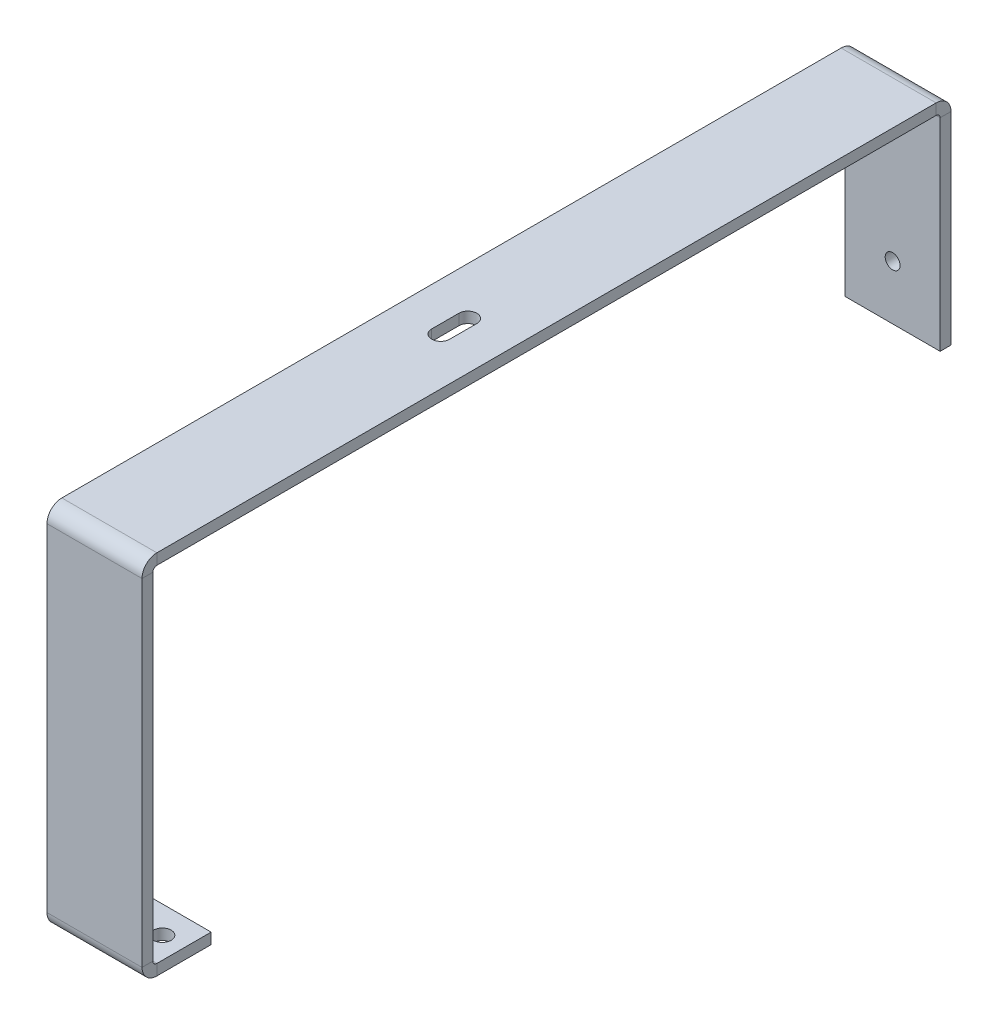
ISO-10303-21;
HEADER;
FILE_DESCRIPTION(('STEP AP214'),'2;1');
FILE_NAME('part.step','',(''),(''),'','','');
FILE_SCHEMA(('AUTOMOTIVE_DESIGN { 1 0 10303 214 1 1 1 1 }'));
ENDSEC;
DATA;
#1=APPLICATION_CONTEXT('core data for automotive mechanical design processes');
#2=APPLICATION_PROTOCOL_DEFINITION('international standard','automotive_design',2000,#1);
#3=PRODUCT_CONTEXT('',#1,'mechanical');
#4=PRODUCT('Part','Part','',(#3));
#5=PRODUCT_RELATED_PRODUCT_CATEGORY('part','',(#4));
#6=PRODUCT_DEFINITION_FORMATION('','',#4);
#7=PRODUCT_DEFINITION_CONTEXT('part definition',#1,'design');
#8=PRODUCT_DEFINITION('design','',#6,#7);
#9=PRODUCT_DEFINITION_SHAPE('','',#8);
#10=(LENGTH_UNIT() NAMED_UNIT(*) SI_UNIT(.MILLI.,.METRE.));
#11=(NAMED_UNIT(*) PLANE_ANGLE_UNIT() SI_UNIT($,.RADIAN.));
#12=(NAMED_UNIT(*) SI_UNIT($,.STERADIAN.) SOLID_ANGLE_UNIT());
#13=UNCERTAINTY_MEASURE_WITH_UNIT(LENGTH_MEASURE(1.E-05),#10,'distance_accuracy_value','');
#14=(GEOMETRIC_REPRESENTATION_CONTEXT(3) GLOBAL_UNCERTAINTY_ASSIGNED_CONTEXT((#13)) GLOBAL_UNIT_ASSIGNED_CONTEXT((#10,
#11,#12)) REPRESENTATION_CONTEXT('',''));
#15=CARTESIAN_POINT('',(0.,0.,0.));
#16=DIRECTION('',(0.,0.,1.));
#17=DIRECTION('',(1.,0.,0.));
#18=AXIS2_PLACEMENT_3D('',#15,#16,#17);
#19=CARTESIAN_POINT('',(8.74999999999997,67.5000000000005,-141.2634));
#20=DIRECTION('',(-1.,0.,0.));
#21=DIRECTION('',(0.,0.,1.));
#22=AXIS2_PLACEMENT_3D('',#19,#20,#21);
#23=PLANE('',#22);
#24=DIRECTION('',(0.,1.,0.));
#25=VECTOR('',#24,1.);
#26=CARTESIAN_POINT('',(8.74999999999999,65.5000000000005,-138.5268));
#27=LINE('',#26,#25);
#28=CARTESIAN_POINT('',(8.74999999999997,65.5000000000005,-138.5268));
#29=VERTEX_POINT('',#28);
#30=CARTESIAN_POINT('',(8.74999999999999,67.5000000000005,-138.5268));
#31=VERTEX_POINT('',#30);
#32=EDGE_CURVE('E320',#29,#31,#27,.T.);
#33=ORIENTED_EDGE('',*,*,#32,.T.);
#34=DIRECTION('',(0.,0.,-1.));
#35=VECTOR('',#34,1.);
#36=CARTESIAN_POINT('',(8.74999999999999,67.5,2.41627914483495E-13));
#37=LINE('',#36,#35);
#38=CARTESIAN_POINT('',(8.74999999999998,67.5,5.));
#39=VERTEX_POINT('',#38);
#40=EDGE_CURVE('E340',#39,#31,#37,.T.);
#41=ORIENTED_EDGE('',*,*,#40,.F.);
#42=DIRECTION('',(0.,-1.,0.));
#43=VECTOR('',#42,1.);
#44=CARTESIAN_POINT('',(8.74999999999998,65.5,4.99999999999999));
#45=LINE('',#44,#43);
#46=CARTESIAN_POINT('',(8.74999999999998,65.5,4.99999999999999));
#47=VERTEX_POINT('',#46);
#48=EDGE_CURVE('E350',#47,#39,#45,.F.);
#49=ORIENTED_EDGE('',*,*,#48,.F.);
#50=DIRECTION('',(0.,0.,1.));
#51=VECTOR('',#50,1.);
#52=CARTESIAN_POINT('',(8.74999999999997,65.5000000000005,-141.2634));
#53=LINE('',#52,#51);
#54=EDGE_CURVE('E344',#47,#29,#53,.F.);
#55=ORIENTED_EDGE('',*,*,#54,.T.);
#56=EDGE_LOOP('',(#33,#41,#49,#55));
#57=FACE_BOUND('',#56,.T.);
#58=ADVANCED_FACE('F103',(#57),#23,.F.);
#59=CARTESIAN_POINT('',(-8.75000000000002,67.5,5.7366));
#60=DIRECTION('',(1.,0.,0.));
#61=DIRECTION('',(0.,0.,-1.));
#62=AXIS2_PLACEMENT_3D('',#59,#60,#61);
#63=PLANE('',#62);
#64=DIRECTION('',(0.,1.,0.));
#65=VECTOR('',#64,1.);
#66=CARTESIAN_POINT('',(-8.75,65.5000000000005,-138.5268));
#67=LINE('',#66,#65);
#68=CARTESIAN_POINT('',(-8.75,65.5000000000005,-138.5268));
#69=VERTEX_POINT('',#68);
#70=CARTESIAN_POINT('',(-8.75,67.5000000000005,-138.5268));
#71=VERTEX_POINT('',#70);
#72=EDGE_CURVE('E331',#69,#71,#67,.T.);
#73=ORIENTED_EDGE('',*,*,#72,.F.);
#74=DIRECTION('',(0.,0.,-1.));
#75=VECTOR('',#74,1.);
#76=CARTESIAN_POINT('',(-8.75000000000002,65.5,5.7366));
#77=LINE('',#76,#75);
#78=CARTESIAN_POINT('',(-8.75000000000002,65.5,4.99999999999999));
#79=VERTEX_POINT('',#78);
#80=EDGE_CURVE('E342',#69,#79,#77,.F.);
#81=ORIENTED_EDGE('',*,*,#80,.T.);
#82=DIRECTION('',(0.,-1.,0.));
#83=VECTOR('',#82,1.);
#84=CARTESIAN_POINT('',(-8.75000000000002,67.5,5.));
#85=LINE('',#84,#83);
#86=CARTESIAN_POINT('',(-8.75000000000002,67.5,5.));
#87=VERTEX_POINT('',#86);
#88=EDGE_CURVE('E334',#79,#87,#85,.F.);
#89=ORIENTED_EDGE('',*,*,#88,.T.);
#90=DIRECTION('',(0.,0.,1.));
#91=VECTOR('',#90,1.);
#92=CARTESIAN_POINT('',(-8.75000000000002,67.5,2.42763745330861E-13));
#93=LINE('',#92,#91);
#94=EDGE_CURVE('E337',#71,#87,#93,.T.);
#95=ORIENTED_EDGE('',*,*,#94,.F.);
#96=EDGE_LOOP('',(#73,#81,#89,#95));
#97=FACE_BOUND('',#96,.T.);
#98=ADVANCED_FACE('F528',(#97),#63,.F.);
#99=CARTESIAN_POINT('',(0.,67.5,2.42763745330861E-13));
#100=DIRECTION('',(0.,-1.,0.));
#101=DIRECTION('',(0.,0.,-1.));
#102=AXIS2_PLACEMENT_3D('',#99,#100,#101);
#103=PLANE('',#102);
#104=DIRECTION('',(0.,0.,1.));
#105=VECTOR('',#104,1.);
#106=CARTESIAN_POINT('',(-1.65,67.5000000000002,-61.0268));
#107=LINE('',#106,#105);
#108=CARTESIAN_POINT('',(-1.65,67.5000000000002,-61.0268));
#109=VERTEX_POINT('',#108);
#110=CARTESIAN_POINT('',(-1.65,67.5000000000002,-56.0267999999999));
#111=VERTEX_POINT('',#110);
#112=EDGE_CURVE('E782',#109,#111,#107,.T.);
#113=ORIENTED_EDGE('',*,*,#112,.F.);
#114=CARTESIAN_POINT('',(0.,67.5000000000002,-61.0268));
#115=DIRECTION('',(0.,-1.,0.));
#116=DIRECTION('',(0.,0.,-1.));
#117=AXIS2_PLACEMENT_3D('',#114,#115,#116);
#118=CIRCLE('',#117,1.65);
#119=CARTESIAN_POINT('',(1.65,67.5000000000002,-61.0268));
#120=VERTEX_POINT('',#119);
#121=EDGE_CURVE('E271',#120,#109,#118,.F.);
#122=ORIENTED_EDGE('',*,*,#121,.F.);
#123=DIRECTION('',(0.,0.,-1.));
#124=VECTOR('',#123,1.);
#125=CARTESIAN_POINT('',(1.65,67.5000000000002,-61.0268));
#126=LINE('',#125,#124);
#127=CARTESIAN_POINT('',(1.65,67.5000000000002,-56.0268));
#128=VERTEX_POINT('',#127);
#129=EDGE_CURVE('E268',#128,#120,#126,.T.);
#130=ORIENTED_EDGE('',*,*,#129,.F.);
#131=CARTESIAN_POINT('',(0.,67.5000000000002,-56.0268));
#132=DIRECTION('',(0.,-1.,0.));
#133=DIRECTION('',(0.,0.,-1.));
#134=AXIS2_PLACEMENT_3D('',#131,#132,#133);
#135=CIRCLE('',#134,1.65);
#136=EDGE_CURVE('E246',#111,#128,#135,.F.);
#137=ORIENTED_EDGE('',*,*,#136,.F.);
#138=EDGE_LOOP('',(#113,#122,#130,#137));
#139=FACE_BOUND('',#138,.T.);
#140=DIRECTION('',(1.,0.,0.));
#141=VECTOR('',#140,1.);
#142=CARTESIAN_POINT('',(8.75,67.5000000000005,-138.5268));
#143=LINE('',#142,#141);
#144=EDGE_CURVE('E314',#31,#71,#143,.F.);
#145=ORIENTED_EDGE('',*,*,#144,.T.);
#146=ORIENTED_EDGE('',*,*,#94,.T.);
#147=DIRECTION('',(1.,0.,0.));
#148=VECTOR('',#147,1.);
#149=CARTESIAN_POINT('',(-8.75000000000002,67.5,5.));
#150=LINE('',#149,#148);
#151=EDGE_CURVE('E347',#39,#87,#150,.F.);
#152=ORIENTED_EDGE('',*,*,#151,.F.);
#153=ORIENTED_EDGE('',*,*,#40,.T.);
#154=EDGE_LOOP('',(#145,#146,#152,#153));
#155=FACE_BOUND('',#154,.T.);
#156=ADVANCED_FACE('F477',(#139,#155),#103,.F.);
#157=CARTESIAN_POINT('',(0.,65.5,2.35780782653174E-13));
#158=DIRECTION('',(0.,-1.,0.));
#159=DIRECTION('',(0.,0.,-1.));
#160=AXIS2_PLACEMENT_3D('',#157,#158,#159);
#161=PLANE('',#160);
#162=CARTESIAN_POINT('',(0.,65.5000000000002,-61.0268));
#163=DIRECTION('',(0.,-1.,0.));
#164=DIRECTION('',(0.,0.,-1.));
#165=AXIS2_PLACEMENT_3D('',#162,#163,#164);
#166=CIRCLE('',#165,1.65);
#167=CARTESIAN_POINT('',(-1.65,65.5000000000002,-61.0268));
#168=VERTEX_POINT('',#167);
#169=CARTESIAN_POINT('',(1.65,65.5000000000002,-61.0268));
#170=VERTEX_POINT('',#169);
#171=EDGE_CURVE('E126',#168,#170,#166,.T.);
#172=ORIENTED_EDGE('',*,*,#171,.F.);
#173=DIRECTION('',(0.,0.,-1.));
#174=VECTOR('',#173,1.);
#175=CARTESIAN_POINT('',(-1.65,65.5000000000002,-61.0268));
#176=LINE('',#175,#174);
#177=CARTESIAN_POINT('',(-1.65,65.5000000000002,-56.0268));
#178=VERTEX_POINT('',#177);
#179=EDGE_CURVE('E259',#178,#168,#176,.T.);
#180=ORIENTED_EDGE('',*,*,#179,.F.);
#181=CARTESIAN_POINT('',(0.,65.5000000000002,-56.0268));
#182=DIRECTION('',(0.,-1.,0.));
#183=DIRECTION('',(0.,0.,-1.));
#184=AXIS2_PLACEMENT_3D('',#181,#182,#183);
#185=CIRCLE('',#184,1.65);
#186=CARTESIAN_POINT('',(1.65,65.5000000000002,-56.0268));
#187=VERTEX_POINT('',#186);
#188=EDGE_CURVE('E243',#187,#178,#185,.T.);
#189=ORIENTED_EDGE('',*,*,#188,.F.);
#190=DIRECTION('',(0.,0.,1.));
#191=VECTOR('',#190,1.);
#192=CARTESIAN_POINT('',(1.65,65.5000000000002,-61.0268));
#193=LINE('',#192,#191);
#194=EDGE_CURVE('E252',#170,#187,#193,.T.);
#195=ORIENTED_EDGE('',*,*,#194,.F.);
#196=EDGE_LOOP('',(#172,#180,#189,#195));
#197=FACE_BOUND('',#196,.T.);
#198=ORIENTED_EDGE('',*,*,#80,.F.);
#199=DIRECTION('',(1.,0.,0.));
#200=VECTOR('',#199,1.);
#201=CARTESIAN_POINT('',(8.75,65.5000000000005,-138.5268));
#202=LINE('',#201,#200);
#203=EDGE_CURVE('E326',#29,#69,#202,.F.);
#204=ORIENTED_EDGE('',*,*,#203,.F.);
#205=ORIENTED_EDGE('',*,*,#54,.F.);
#206=DIRECTION('',(1.,0.,0.));
#207=VECTOR('',#206,1.);
#208=CARTESIAN_POINT('',(-8.75000000000002,65.5,4.99999999999999));
#209=LINE('',#208,#207);
#210=EDGE_CURVE('E353',#79,#47,#209,.T.);
#211=ORIENTED_EDGE('',*,*,#210,.F.);
#212=EDGE_LOOP('',(#198,#204,#205,#211));
#213=FACE_BOUND('',#212,.T.);
#214=ADVANCED_FACE('F256',(#197,#213),#161,.T.);
#215=CARTESIAN_POINT('',(8.74999999999999,67.5,7.7366));
#216=DIRECTION('',(-1.,0.,0.));
#217=DIRECTION('',(0.,-1.,0.));
#218=AXIS2_PLACEMENT_3D('',#215,#216,#217);
#219=PLANE('',#218);
#220=DIRECTION('',(0.,0.,1.));
#221=VECTOR('',#220,1.);
#222=CARTESIAN_POINT('',(8.74999999999998,64.7634,5.73659999999999));
#223=LINE('',#222,#221);
#224=CARTESIAN_POINT('',(8.74999999999999,64.7634,5.7366));
#225=VERTEX_POINT('',#224);
#226=CARTESIAN_POINT('',(8.74999999999998,64.7634,7.73659999999999));
#227=VERTEX_POINT('',#226);
#228=EDGE_CURVE('E363',#225,#227,#223,.T.);
#229=ORIENTED_EDGE('',*,*,#228,.T.);
#230=DIRECTION('',(0.,1.,0.));
#231=VECTOR('',#230,1.);
#232=CARTESIAN_POINT('',(8.74999999999999,0.,7.7366));
#233=LINE('',#232,#231);
#234=CARTESIAN_POINT('',(8.74999999999999,2.7366,7.7366));
#235=VERTEX_POINT('',#234);
#236=EDGE_CURVE('E383',#235,#227,#233,.T.);
#237=ORIENTED_EDGE('',*,*,#236,.F.);
#238=DIRECTION('',(0.,0.,-1.));
#239=VECTOR('',#238,1.);
#240=CARTESIAN_POINT('',(8.74999999999999,2.7366,5.7366));
#241=LINE('',#240,#239);
#242=CARTESIAN_POINT('',(8.74999999999999,2.7366,5.7366));
#243=VERTEX_POINT('',#242);
#244=EDGE_CURVE('E393',#243,#235,#241,.F.);
#245=ORIENTED_EDGE('',*,*,#244,.F.);
#246=DIRECTION('',(0.,-1.,0.));
#247=VECTOR('',#246,1.);
#248=CARTESIAN_POINT('',(8.74999999999999,67.5,5.7366));
#249=LINE('',#248,#247);
#250=EDGE_CURVE('E387',#243,#225,#249,.F.);
#251=ORIENTED_EDGE('',*,*,#250,.T.);
#252=EDGE_LOOP('',(#229,#237,#245,#251));
#253=FACE_BOUND('',#252,.T.);
#254=ADVANCED_FACE('F461',(#253),#219,.F.);
#255=CARTESIAN_POINT('',(-8.74999999999999,2.,7.7366));
#256=DIRECTION('',(1.,0.,0.));
#257=DIRECTION('',(0.,1.,0.));
#258=AXIS2_PLACEMENT_3D('',#255,#256,#257);
#259=PLANE('',#258);
#260=DIRECTION('',(0.,0.,1.));
#261=VECTOR('',#260,1.);
#262=CARTESIAN_POINT('',(-8.75000000000002,64.7634,5.73659999999999));
#263=LINE('',#262,#261);
#264=CARTESIAN_POINT('',(-8.75000000000002,64.7634,5.73659999999999));
#265=VERTEX_POINT('',#264);
#266=CARTESIAN_POINT('',(-8.75000000000002,64.7634,7.7366));
#267=VERTEX_POINT('',#266);
#268=EDGE_CURVE('E374',#265,#267,#263,.T.);
#269=ORIENTED_EDGE('',*,*,#268,.F.);
#270=DIRECTION('',(0.,1.,0.));
#271=VECTOR('',#270,1.);
#272=CARTESIAN_POINT('',(-8.74999999999999,2.,5.7366));
#273=LINE('',#272,#271);
#274=CARTESIAN_POINT('',(-8.74999999999998,2.7366,5.7366));
#275=VERTEX_POINT('',#274);
#276=EDGE_CURVE('E385',#265,#275,#273,.F.);
#277=ORIENTED_EDGE('',*,*,#276,.T.);
#278=DIRECTION('',(0.,0.,-1.));
#279=VECTOR('',#278,1.);
#280=CARTESIAN_POINT('',(-8.74999999999999,2.7366,7.7366));
#281=LINE('',#280,#279);
#282=CARTESIAN_POINT('',(-8.74999999999998,2.7366,7.7366));
#283=VERTEX_POINT('',#282);
#284=EDGE_CURVE('E377',#275,#283,#281,.F.);
#285=ORIENTED_EDGE('',*,*,#284,.T.);
#286=DIRECTION('',(0.,-1.,0.));
#287=VECTOR('',#286,1.);
#288=CARTESIAN_POINT('',(-8.74999999999999,0.,7.7366));
#289=LINE('',#288,#287);
#290=EDGE_CURVE('E380',#267,#283,#289,.T.);
#291=ORIENTED_EDGE('',*,*,#290,.F.);
#292=EDGE_LOOP('',(#269,#277,#285,#291));
#293=FACE_BOUND('',#292,.T.);
#294=ADVANCED_FACE('F553',(#293),#259,.F.);
#295=CARTESIAN_POINT('',(0.,0.,7.7366));
#296=DIRECTION('',(0.,0.,-1.));
#297=DIRECTION('',(-1.,0.,0.));
#298=AXIS2_PLACEMENT_3D('',#295,#296,#297);
#299=PLANE('',#298);
#300=DIRECTION('',(1.,0.,0.));
#301=VECTOR('',#300,1.);
#302=CARTESIAN_POINT('',(8.74999999999999,64.7634,7.73659999999999));
#303=LINE('',#302,#301);
#304=EDGE_CURVE('E357',#227,#267,#303,.F.);
#305=ORIENTED_EDGE('',*,*,#304,.T.);
#306=ORIENTED_EDGE('',*,*,#290,.T.);
#307=DIRECTION('',(1.,0.,0.));
#308=VECTOR('',#307,1.);
#309=CARTESIAN_POINT('',(-8.75,2.7366,7.7366));
#310=LINE('',#309,#308);
#311=EDGE_CURVE('E390',#235,#283,#310,.F.);
#312=ORIENTED_EDGE('',*,*,#311,.F.);
#313=ORIENTED_EDGE('',*,*,#236,.T.);
#314=EDGE_LOOP('',(#305,#306,#312,#313));
#315=FACE_BOUND('',#314,.T.);
#316=ADVANCED_FACE('F457',(#315),#299,.F.);
#317=CARTESIAN_POINT('',(0.,0.,5.7366));
#318=DIRECTION('',(0.,0.,-1.));
#319=DIRECTION('',(-1.,0.,0.));
#320=AXIS2_PLACEMENT_3D('',#317,#318,#319);
#321=PLANE('',#320);
#322=ORIENTED_EDGE('',*,*,#276,.F.);
#323=DIRECTION('',(1.,0.,0.));
#324=VECTOR('',#323,1.);
#325=CARTESIAN_POINT('',(8.74999999999999,64.7634,5.73659999999999));
#326=LINE('',#325,#324);
#327=EDGE_CURVE('E369',#225,#265,#326,.F.);
#328=ORIENTED_EDGE('',*,*,#327,.F.);
#329=ORIENTED_EDGE('',*,*,#250,.F.);
#330=DIRECTION('',(1.,0.,0.));
#331=VECTOR('',#330,1.);
#332=CARTESIAN_POINT('',(-8.75,2.7366,5.7366));
#333=LINE('',#332,#331);
#334=EDGE_CURVE('E396',#275,#243,#333,.T.);
#335=ORIENTED_EDGE('',*,*,#334,.F.);
#336=EDGE_LOOP('',(#322,#328,#329,#335));
#337=FACE_BOUND('',#336,.T.);
#338=ADVANCED_FACE('F552',(#337),#321,.T.);
#339=CARTESIAN_POINT('',(8.75,2.,-5.));
#340=DIRECTION('',(-1.,0.,0.));
#341=DIRECTION('',(0.,0.,1.));
#342=AXIS2_PLACEMENT_3D('',#339,#340,#341);
#343=PLANE('',#342);
#344=DIRECTION('',(0.,0.,-1.));
#345=VECTOR('',#344,1.);
#346=CARTESIAN_POINT('',(8.75,0.,-5.));
#347=LINE('',#346,#345);
#348=CARTESIAN_POINT('',(8.74999999999999,0.,5.));
#349=VERTEX_POINT('',#348);
#350=CARTESIAN_POINT('',(8.75,0.,-5.));
#351=VERTEX_POINT('',#350);
#352=EDGE_CURVE('E403',#349,#351,#347,.T.);
#353=ORIENTED_EDGE('',*,*,#352,.T.);
#354=DIRECTION('',(0.,-1.,0.));
#355=VECTOR('',#354,1.);
#356=CARTESIAN_POINT('',(8.75,2.,-5.));
#357=LINE('',#356,#355);
#358=CARTESIAN_POINT('',(8.75,2.,-5.));
#359=VERTEX_POINT('',#358);
#360=EDGE_CURVE('E13',#359,#351,#357,.T.);
#361=ORIENTED_EDGE('',*,*,#360,.F.);
#362=DIRECTION('',(0.,0.,-1.));
#363=VECTOR('',#362,1.);
#364=CARTESIAN_POINT('',(8.75,2.,-5.));
#365=LINE('',#364,#363);
#366=CARTESIAN_POINT('',(8.75,2.,5.));
#367=VERTEX_POINT('',#366);
#368=EDGE_CURVE('E412',#367,#359,#365,.T.);
#369=ORIENTED_EDGE('',*,*,#368,.F.);
#370=DIRECTION('',(0.,-1.,0.));
#371=VECTOR('',#370,1.);
#372=CARTESIAN_POINT('',(8.75,2.,5.));
#373=LINE('',#372,#371);
#374=EDGE_CURVE('E422',#367,#349,#373,.T.);
#375=ORIENTED_EDGE('',*,*,#374,.T.);
#376=EDGE_LOOP('',(#353,#361,#369,#375));
#377=FACE_BOUND('',#376,.T.);
#378=ADVANCED_FACE('F105',(#377),#343,.F.);
#379=CARTESIAN_POINT('',(-8.75,2.,-5.));
#380=DIRECTION('',(0.,0.,1.));
#381=DIRECTION('',(1.,0.,0.));
#382=AXIS2_PLACEMENT_3D('',#379,#380,#381);
#383=PLANE('',#382);
#384=DIRECTION('',(-1.,0.,0.));
#385=VECTOR('',#384,1.);
#386=CARTESIAN_POINT('',(-8.75,0.,-5.));
#387=LINE('',#386,#385);
#388=CARTESIAN_POINT('',(-8.75,0.,-5.));
#389=VERTEX_POINT('',#388);
#390=EDGE_CURVE('E425',#351,#389,#387,.T.);
#391=ORIENTED_EDGE('',*,*,#390,.T.);
#392=DIRECTION('',(0.,-1.,0.));
#393=VECTOR('',#392,1.);
#394=CARTESIAN_POINT('',(-8.75,2.,-5.));
#395=LINE('',#394,#393);
#396=CARTESIAN_POINT('',(-8.75,2.,-5.));
#397=VERTEX_POINT('',#396);
#398=EDGE_CURVE('E111',#397,#389,#395,.T.);
#399=ORIENTED_EDGE('',*,*,#398,.F.);
#400=DIRECTION('',(-1.,0.,0.));
#401=VECTOR('',#400,1.);
#402=CARTESIAN_POINT('',(-8.75,2.,-5.));
#403=LINE('',#402,#401);
#404=EDGE_CURVE('E415',#359,#397,#403,.T.);
#405=ORIENTED_EDGE('',*,*,#404,.F.);
#406=ORIENTED_EDGE('',*,*,#360,.T.);
#407=EDGE_LOOP('',(#391,#399,#405,#406));
#408=FACE_BOUND('',#407,.T.);
#409=ADVANCED_FACE('F581',(#408),#383,.F.);
#410=CARTESIAN_POINT('',(-8.75,2.,-5.));
#411=DIRECTION('',(1.,0.,0.));
#412=DIRECTION('',(0.,0.,-1.));
#413=AXIS2_PLACEMENT_3D('',#410,#411,#412);
#414=PLANE('',#413);
#415=DIRECTION('',(0.,0.,1.));
#416=VECTOR('',#415,1.);
#417=CARTESIAN_POINT('',(-8.75,0.,-5.));
#418=LINE('',#417,#416);
#419=CARTESIAN_POINT('',(-8.75,0.,5.));
#420=VERTEX_POINT('',#419);
#421=EDGE_CURVE('E427',#389,#420,#418,.T.);
#422=ORIENTED_EDGE('',*,*,#421,.T.);
#423=DIRECTION('',(0.,-1.,0.));
#424=VECTOR('',#423,1.);
#425=CARTESIAN_POINT('',(-8.75,2.,5.));
#426=LINE('',#425,#424);
#427=CARTESIAN_POINT('',(-8.75,2.,5.));
#428=VERTEX_POINT('',#427);
#429=EDGE_CURVE('E433',#428,#420,#426,.T.);
#430=ORIENTED_EDGE('',*,*,#429,.F.);
#431=DIRECTION('',(0.,0.,1.));
#432=VECTOR('',#431,1.);
#433=CARTESIAN_POINT('',(-8.75,2.,-5.));
#434=LINE('',#433,#432);
#435=EDGE_CURVE('E418',#397,#428,#434,.T.);
#436=ORIENTED_EDGE('',*,*,#435,.F.);
#437=ORIENTED_EDGE('',*,*,#398,.T.);
#438=EDGE_LOOP('',(#422,#430,#436,#437));
#439=FACE_BOUND('',#438,.T.);
#440=ADVANCED_FACE('F440',(#439),#414,.F.);
#441=CARTESIAN_POINT('',(0.,2.,0.));
#442=DIRECTION('',(0.,1.,0.));
#443=DIRECTION('',(0.,0.,1.));
#444=AXIS2_PLACEMENT_3D('',#441,#442,#443);
#445=PLANE('',#444);
#446=CARTESIAN_POINT('',(-4.75,2.,0.));
#447=DIRECTION('',(0.,1.,0.));
#448=DIRECTION('',(0.,0.,1.));
#449=AXIS2_PLACEMENT_3D('',#446,#447,#448);
#450=CIRCLE('',#449,1.63195);
#451=CARTESIAN_POINT('',(-4.75,2.,1.63195));
#452=VERTEX_POINT('',#451);
#453=EDGE_CURVE('E274',#452,#452,#450,.F.);
#454=ORIENTED_EDGE('',*,*,#453,.T.);
#455=EDGE_LOOP('',(#454));
#456=FACE_BOUND('',#455,.T.);
#457=CARTESIAN_POINT('',(4.75,2.,0.));
#458=DIRECTION('',(0.,1.,0.));
#459=DIRECTION('',(0.,0.,1.));
#460=AXIS2_PLACEMENT_3D('',#457,#458,#459);
#461=CIRCLE('',#460,1.63195);
#462=CARTESIAN_POINT('',(4.75,2.,1.63195));
#463=VERTEX_POINT('',#462);
#464=EDGE_CURVE('E280',#463,#463,#461,.F.);
#465=ORIENTED_EDGE('',*,*,#464,.T.);
#466=EDGE_LOOP('',(#465));
#467=FACE_BOUND('',#466,.T.);
#468=ORIENTED_EDGE('',*,*,#368,.T.);
#469=ORIENTED_EDGE('',*,*,#404,.T.);
#470=ORIENTED_EDGE('',*,*,#435,.T.);
#471=DIRECTION('',(1.,0.,0.));
#472=VECTOR('',#471,1.);
#473=CARTESIAN_POINT('',(-8.75,2.,5.));
#474=LINE('',#473,#472);
#475=EDGE_CURVE('E420',#428,#367,#474,.T.);
#476=ORIENTED_EDGE('',*,*,#475,.T.);
#477=EDGE_LOOP('',(#468,#469,#470,#476));
#478=FACE_BOUND('',#477,.T.);
#479=ADVANCED_FACE('F573',(#456,#467,#478),#445,.T.);
#480=CARTESIAN_POINT('',(0.,0.,0.));
#481=DIRECTION('',(0.,1.,0.));
#482=DIRECTION('',(0.,0.,1.));
#483=AXIS2_PLACEMENT_3D('',#480,#481,#482);
#484=PLANE('',#483);
#485=CARTESIAN_POINT('',(-4.75,0.,0.));
#486=DIRECTION('',(0.,-1.,0.));
#487=DIRECTION('',(0.,0.,-1.));
#488=AXIS2_PLACEMENT_3D('',#485,#486,#487);
#489=CIRCLE('',#488,1.63195);
#490=CARTESIAN_POINT('',(-4.75,0.,-1.63195));
#491=VERTEX_POINT('',#490);
#492=EDGE_CURVE('E270',#491,#491,#489,.T.);
#493=ORIENTED_EDGE('',*,*,#492,.F.);
#494=EDGE_LOOP('',(#493));
#495=FACE_BOUND('',#494,.T.);
#496=CARTESIAN_POINT('',(4.75,0.,0.));
#497=DIRECTION('',(0.,-1.,0.));
#498=DIRECTION('',(0.,0.,-1.));
#499=AXIS2_PLACEMENT_3D('',#496,#497,#498);
#500=CIRCLE('',#499,1.63195);
#501=CARTESIAN_POINT('',(4.75,0.,-1.63195));
#502=VERTEX_POINT('',#501);
#503=EDGE_CURVE('E277',#502,#502,#500,.T.);
#504=ORIENTED_EDGE('',*,*,#503,.F.);
#505=EDGE_LOOP('',(#504));
#506=FACE_BOUND('',#505,.T.);
#507=ORIENTED_EDGE('',*,*,#352,.F.);
#508=DIRECTION('',(1.,0.,0.));
#509=VECTOR('',#508,1.);
#510=CARTESIAN_POINT('',(-8.75,0.,5.));
#511=LINE('',#510,#509);
#512=EDGE_CURVE('E416',#420,#349,#511,.T.);
#513=ORIENTED_EDGE('',*,*,#512,.F.);
#514=ORIENTED_EDGE('',*,*,#421,.F.);
#515=ORIENTED_EDGE('',*,*,#390,.F.);
#516=EDGE_LOOP('',(#507,#513,#514,#515));
#517=FACE_BOUND('',#516,.T.);
#518=ADVANCED_FACE('F445',(#495,#506,#517),#484,.F.);
#519=CARTESIAN_POINT('',(-8.74999999999999,2.7366,5.));
#520=DIRECTION('',(-1.,0.,0.));
#521=DIRECTION('',(0.,0.,1.));
#522=AXIS2_PLACEMENT_3D('',#519,#520,#521);
#523=PLANE('',#522);
#524=ORIENTED_EDGE('',*,*,#284,.F.);
#525=CARTESIAN_POINT('',(-8.74999999999999,2.7366,5.));
#526=DIRECTION('',(1.,0.,0.));
#527=DIRECTION('',(0.,0.,-1.));
#528=AXIS2_PLACEMENT_3D('',#525,#526,#527);
#529=CIRCLE('',#528,0.736599999999998);
#530=EDGE_CURVE('E407',#428,#275,#529,.F.);
#531=ORIENTED_EDGE('',*,*,#530,.F.);
#532=ORIENTED_EDGE('',*,*,#429,.T.);
#533=CARTESIAN_POINT('',(-8.74999999999998,2.7366,5.));
#534=DIRECTION('',(1.,0.,0.));
#535=DIRECTION('',(0.,0.,-1.));
#536=AXIS2_PLACEMENT_3D('',#533,#534,#535);
#537=CIRCLE('',#536,2.7366);
#538=EDGE_CURVE('E400',#420,#283,#537,.F.);
#539=ORIENTED_EDGE('',*,*,#538,.T.);
#540=EDGE_LOOP('',(#524,#531,#532,#539));
#541=FACE_BOUND('',#540,.T.);
#542=ADVANCED_FACE('F451',(#541),#523,.T.);
#543=CARTESIAN_POINT('',(8.74999999999999,2.7366,5.));
#544=DIRECTION('',(-1.,0.,0.));
#545=DIRECTION('',(0.,0.,1.));
#546=AXIS2_PLACEMENT_3D('',#543,#544,#545);
#547=PLANE('',#546);
#548=CARTESIAN_POINT('',(8.74999999999999,2.7366,5.));
#549=DIRECTION('',(1.,0.,0.));
#550=DIRECTION('',(0.,0.,-1.));
#551=AXIS2_PLACEMENT_3D('',#548,#549,#550);
#552=CIRCLE('',#551,0.736599999999998);
#553=EDGE_CURVE('E382',#243,#367,#552,.T.);
#554=ORIENTED_EDGE('',*,*,#553,.F.);
#555=ORIENTED_EDGE('',*,*,#244,.T.);
#556=CARTESIAN_POINT('',(8.74999999999999,2.7366,5.));
#557=DIRECTION('',(1.,0.,0.));
#558=DIRECTION('',(0.,0.,-1.));
#559=AXIS2_PLACEMENT_3D('',#556,#557,#558);
#560=CIRCLE('',#559,2.7366);
#561=EDGE_CURVE('E404',#235,#349,#560,.T.);
#562=ORIENTED_EDGE('',*,*,#561,.T.);
#563=ORIENTED_EDGE('',*,*,#374,.F.);
#564=EDGE_LOOP('',(#554,#555,#562,#563));
#565=FACE_BOUND('',#564,.T.);
#566=ADVANCED_FACE('F564',(#565),#547,.F.);
#567=CARTESIAN_POINT('',(8.74999999999999,2.7366,5.));
#568=DIRECTION('',(1.,0.,0.));
#569=DIRECTION('',(0.,0.,1.));
#570=AXIS2_PLACEMENT_3D('',#567,#568,#569);
#571=CYLINDRICAL_SURFACE('',#570,2.7366);
#572=ORIENTED_EDGE('',*,*,#512,.T.);
#573=ORIENTED_EDGE('',*,*,#561,.F.);
#574=ORIENTED_EDGE('',*,*,#311,.T.);
#575=ORIENTED_EDGE('',*,*,#538,.F.);
#576=EDGE_LOOP('',(#572,#573,#574,#575));
#577=FACE_BOUND('',#576,.T.);
#578=ADVANCED_FACE('F453',(#577),#571,.T.);
#579=CARTESIAN_POINT('',(8.74999999999999,2.7366,5.));
#580=DIRECTION('',(1.,0.,0.));
#581=DIRECTION('',(0.,0.,1.));
#582=AXIS2_PLACEMENT_3D('',#579,#580,#581);
#583=CYLINDRICAL_SURFACE('',#582,0.736599999999998);
#584=ORIENTED_EDGE('',*,*,#475,.F.);
#585=ORIENTED_EDGE('',*,*,#530,.T.);
#586=ORIENTED_EDGE('',*,*,#334,.T.);
#587=ORIENTED_EDGE('',*,*,#553,.T.);
#588=EDGE_LOOP('',(#584,#585,#586,#587));
#589=FACE_BOUND('',#588,.T.);
#590=ADVANCED_FACE('F546',(#589),#583,.F.);
#591=CARTESIAN_POINT('',(-8.75000000000002,64.7634,4.99999999999999));
#592=DIRECTION('',(-1.,0.,0.));
#593=DIRECTION('',(0.,0.,1.));
#594=AXIS2_PLACEMENT_3D('',#591,#592,#593);
#595=PLANE('',#594);
#596=ORIENTED_EDGE('',*,*,#88,.F.);
#597=CARTESIAN_POINT('',(-8.75000000000002,64.7634,4.99999999999999));
#598=DIRECTION('',(1.,0.,0.));
#599=DIRECTION('',(0.,0.,-1.));
#600=AXIS2_PLACEMENT_3D('',#597,#598,#599);
#601=CIRCLE('',#600,0.736600000000004);
#602=EDGE_CURVE('E366',#265,#79,#601,.F.);
#603=ORIENTED_EDGE('',*,*,#602,.F.);
#604=ORIENTED_EDGE('',*,*,#268,.T.);
#605=CARTESIAN_POINT('',(-8.75000000000002,64.7634,4.99999999999999));
#606=DIRECTION('',(1.,0.,0.));
#607=DIRECTION('',(0.,0.,-1.));
#608=AXIS2_PLACEMENT_3D('',#605,#606,#607);
#609=CIRCLE('',#608,2.7366);
#610=EDGE_CURVE('E359',#267,#87,#609,.F.);
#611=ORIENTED_EDGE('',*,*,#610,.T.);
#612=EDGE_LOOP('',(#596,#603,#604,#611));
#613=FACE_BOUND('',#612,.T.);
#614=ADVANCED_FACE('F543',(#613),#595,.T.);
#615=CARTESIAN_POINT('',(8.74999999999998,64.7634,4.99999999999999));
#616=DIRECTION('',(-1.,0.,0.));
#617=DIRECTION('',(0.,0.,1.));
#618=AXIS2_PLACEMENT_3D('',#615,#616,#617);
#619=PLANE('',#618);
#620=CARTESIAN_POINT('',(8.74999999999998,64.7634,4.99999999999999));
#621=DIRECTION('',(1.,0.,0.));
#622=DIRECTION('',(0.,0.,-1.));
#623=AXIS2_PLACEMENT_3D('',#620,#621,#622);
#624=CIRCLE('',#623,0.736600000000004);
#625=EDGE_CURVE('E339',#47,#225,#624,.T.);
#626=ORIENTED_EDGE('',*,*,#625,.F.);
#627=ORIENTED_EDGE('',*,*,#48,.T.);
#628=CARTESIAN_POINT('',(8.74999999999998,64.7634,4.99999999999999));
#629=DIRECTION('',(1.,0.,0.));
#630=DIRECTION('',(0.,0.,-1.));
#631=AXIS2_PLACEMENT_3D('',#628,#629,#630);
#632=CIRCLE('',#631,2.7366);
#633=EDGE_CURVE('E360',#39,#227,#632,.T.);
#634=ORIENTED_EDGE('',*,*,#633,.T.);
#635=ORIENTED_EDGE('',*,*,#228,.F.);
#636=EDGE_LOOP('',(#626,#627,#634,#635));
#637=FACE_BOUND('',#636,.T.);
#638=ADVANCED_FACE('F470',(#637),#619,.F.);
#639=CARTESIAN_POINT('',(8.74999999999999,64.7634,4.99999999999999));
#640=DIRECTION('',(1.,0.,0.));
#641=DIRECTION('',(0.,1.,0.));
#642=AXIS2_PLACEMENT_3D('',#639,#640,#641);
#643=CYLINDRICAL_SURFACE('',#642,2.7366);
#644=ORIENTED_EDGE('',*,*,#304,.F.);
#645=ORIENTED_EDGE('',*,*,#633,.F.);
#646=ORIENTED_EDGE('',*,*,#151,.T.);
#647=ORIENTED_EDGE('',*,*,#610,.F.);
#648=EDGE_LOOP('',(#644,#645,#646,#647));
#649=FACE_BOUND('',#648,.T.);
#650=ADVANCED_FACE('F469',(#649),#643,.T.);
#651=CARTESIAN_POINT('',(8.74999999999999,64.7634,4.99999999999999));
#652=DIRECTION('',(1.,0.,0.));
#653=DIRECTION('',(0.,1.,0.));
#654=AXIS2_PLACEMENT_3D('',#651,#652,#653);
#655=CYLINDRICAL_SURFACE('',#654,0.736600000000004);
#656=ORIENTED_EDGE('',*,*,#327,.T.);
#657=ORIENTED_EDGE('',*,*,#602,.T.);
#658=ORIENTED_EDGE('',*,*,#210,.T.);
#659=ORIENTED_EDGE('',*,*,#625,.T.);
#660=EDGE_LOOP('',(#656,#657,#658,#659));
#661=FACE_BOUND('',#660,.T.);
#662=ADVANCED_FACE('F540',(#661),#655,.F.);
#663=CARTESIAN_POINT('',(-8.75,64.7634000000005,-138.5268));
#664=DIRECTION('',(-1.,0.,0.));
#665=DIRECTION('',(0.,0.,1.));
#666=AXIS2_PLACEMENT_3D('',#663,#664,#665);
#667=PLANE('',#666);
#668=DIRECTION('',(0.,0.,1.));
#669=VECTOR('',#668,1.);
#670=CARTESIAN_POINT('',(-8.75,64.7634000000005,-141.2634));
#671=LINE('',#670,#669);
#672=CARTESIAN_POINT('',(-8.75,64.7634000000005,-139.2634));
#673=VERTEX_POINT('',#672);
#674=CARTESIAN_POINT('',(-8.75,64.7634000000005,-141.2634));
#675=VERTEX_POINT('',#674);
#676=EDGE_CURVE('E283',#673,#675,#671,.F.);
#677=ORIENTED_EDGE('',*,*,#676,.F.);
#678=CARTESIAN_POINT('',(-8.75,64.7634000000005,-138.5268));
#679=DIRECTION('',(1.,0.,0.));
#680=DIRECTION('',(0.,0.,-1.));
#681=AXIS2_PLACEMENT_3D('',#678,#679,#680);
#682=CIRCLE('',#681,0.736600000000004);
#683=EDGE_CURVE('E323',#69,#673,#682,.F.);
#684=ORIENTED_EDGE('',*,*,#683,.F.);
#685=ORIENTED_EDGE('',*,*,#72,.T.);
#686=CARTESIAN_POINT('',(-8.75,64.7634000000005,-138.5268));
#687=DIRECTION('',(1.,0.,0.));
#688=DIRECTION('',(0.,0.,-1.));
#689=AXIS2_PLACEMENT_3D('',#686,#687,#688);
#690=CIRCLE('',#689,2.7366);
#691=EDGE_CURVE('E316',#71,#675,#690,.F.);
#692=ORIENTED_EDGE('',*,*,#691,.T.);
#693=EDGE_LOOP('',(#677,#684,#685,#692));
#694=FACE_BOUND('',#693,.T.);
#695=ADVANCED_FACE('F507',(#694),#667,.T.);
#696=CARTESIAN_POINT('',(8.74999999999999,64.7634000000005,-138.5268));
#697=DIRECTION('',(-1.,0.,0.));
#698=DIRECTION('',(0.,0.,1.));
#699=AXIS2_PLACEMENT_3D('',#696,#697,#698);
#700=PLANE('',#699);
#701=CARTESIAN_POINT('',(8.74999999999999,64.7634000000005,-138.5268));
#702=DIRECTION('',(1.,0.,0.));
#703=DIRECTION('',(0.,0.,-1.));
#704=AXIS2_PLACEMENT_3D('',#701,#702,#703);
#705=CIRCLE('',#704,0.736600000000004);
#706=CARTESIAN_POINT('',(8.74999999999999,64.7634000000005,-139.2634));
#707=VERTEX_POINT('',#706);
#708=EDGE_CURVE('E287',#707,#29,#705,.T.);
#709=ORIENTED_EDGE('',*,*,#708,.F.);
#710=DIRECTION('',(0.,0.,1.));
#711=VECTOR('',#710,1.);
#712=CARTESIAN_POINT('',(8.74999999999999,64.7634000000005,-139.2634));
#713=LINE('',#712,#711);
#714=CARTESIAN_POINT('',(8.75,64.7634000000005,-141.2634));
#715=VERTEX_POINT('',#714);
#716=EDGE_CURVE('E307',#707,#715,#713,.F.);
#717=ORIENTED_EDGE('',*,*,#716,.T.);
#718=CARTESIAN_POINT('',(8.74999999999999,64.7634000000005,-138.5268));
#719=DIRECTION('',(1.,0.,0.));
#720=DIRECTION('',(0.,0.,-1.));
#721=AXIS2_PLACEMENT_3D('',#718,#719,#720);
#722=CIRCLE('',#721,2.7366);
#723=EDGE_CURVE('E317',#715,#31,#722,.T.);
#724=ORIENTED_EDGE('',*,*,#723,.T.);
#725=ORIENTED_EDGE('',*,*,#32,.F.);
#726=EDGE_LOOP('',(#709,#717,#724,#725));
#727=FACE_BOUND('',#726,.T.);
#728=ADVANCED_FACE('F486',(#727),#700,.F.);
#729=CARTESIAN_POINT('',(8.75,64.7634000000005,-138.5268));
#730=DIRECTION('',(1.,0.,0.));
#731=DIRECTION('',(0.,0.,-1.));
#732=AXIS2_PLACEMENT_3D('',#729,#730,#731);
#733=CYLINDRICAL_SURFACE('',#732,2.7366);
#734=ORIENTED_EDGE('',*,*,#144,.F.);
#735=ORIENTED_EDGE('',*,*,#723,.F.);
#736=DIRECTION('',(1.,0.,0.));
#737=VECTOR('',#736,1.);
#738=CARTESIAN_POINT('',(-8.75,64.7634000000005,-141.2634));
#739=LINE('',#738,#737);
#740=EDGE_CURVE('E305',#715,#675,#739,.F.);
#741=ORIENTED_EDGE('',*,*,#740,.T.);
#742=ORIENTED_EDGE('',*,*,#691,.F.);
#743=EDGE_LOOP('',(#734,#735,#741,#742));
#744=FACE_BOUND('',#743,.T.);
#745=ADVANCED_FACE('F485',(#744),#733,.T.);
#746=CARTESIAN_POINT('',(8.75,64.7634000000005,-138.5268));
#747=DIRECTION('',(1.,0.,0.));
#748=DIRECTION('',(0.,0.,-1.));
#749=AXIS2_PLACEMENT_3D('',#746,#747,#748);
#750=CYLINDRICAL_SURFACE('',#749,0.736600000000004);
#751=ORIENTED_EDGE('',*,*,#203,.T.);
#752=ORIENTED_EDGE('',*,*,#683,.T.);
#753=DIRECTION('',(1.,0.,0.));
#754=VECTOR('',#753,1.);
#755=CARTESIAN_POINT('',(-8.75,64.7634000000005,-139.2634));
#756=LINE('',#755,#754);
#757=EDGE_CURVE('E310',#673,#707,#756,.T.);
#758=ORIENTED_EDGE('',*,*,#757,.T.);
#759=ORIENTED_EDGE('',*,*,#708,.T.);
#760=EDGE_LOOP('',(#751,#752,#758,#759));
#761=FACE_BOUND('',#760,.T.);
#762=ADVANCED_FACE('F510',(#761),#750,.F.);
#763=CARTESIAN_POINT('',(8.75,27.5000000000005,-141.2634));
#764=DIRECTION('',(-1.,0.,0.));
#765=DIRECTION('',(0.,-1.,0.));
#766=AXIS2_PLACEMENT_3D('',#763,#764,#765);
#767=PLANE('',#766);
#768=ORIENTED_EDGE('',*,*,#716,.F.);
#769=DIRECTION('',(0.,1.,0.));
#770=VECTOR('',#769,1.);
#771=CARTESIAN_POINT('',(8.75,27.5000000000005,-139.2634));
#772=LINE('',#771,#770);
#773=CARTESIAN_POINT('',(8.75,27.5000000000005,-139.2634));
#774=VERTEX_POINT('',#773);
#775=EDGE_CURVE('E303',#707,#774,#772,.F.);
#776=ORIENTED_EDGE('',*,*,#775,.T.);
#777=DIRECTION('',(0.,0.,1.));
#778=VECTOR('',#777,1.);
#779=CARTESIAN_POINT('',(8.75,27.5000000000005,-141.2634));
#780=LINE('',#779,#778);
#781=CARTESIAN_POINT('',(8.75,27.5000000000005,-141.2634));
#782=VERTEX_POINT('',#781);
#783=EDGE_CURVE('E284',#782,#774,#780,.T.);
#784=ORIENTED_EDGE('',*,*,#783,.F.);
#785=DIRECTION('',(0.,-1.,0.));
#786=VECTOR('',#785,1.);
#787=CARTESIAN_POINT('',(8.74999999999999,1.03838535672489E-12,-141.2634));
#788=LINE('',#787,#786);
#789=EDGE_CURVE('E296',#715,#782,#788,.T.);
#790=ORIENTED_EDGE('',*,*,#789,.F.);
#791=EDGE_LOOP('',(#768,#776,#784,#790));
#792=FACE_BOUND('',#791,.T.);
#793=ADVANCED_FACE('F496',(#792),#767,.F.);
#794=CARTESIAN_POINT('',(-8.75,65.5000000000005,-141.2634));
#795=DIRECTION('',(1.,0.,0.));
#796=DIRECTION('',(0.,1.,0.));
#797=AXIS2_PLACEMENT_3D('',#794,#795,#796);
#798=PLANE('',#797);
#799=ORIENTED_EDGE('',*,*,#676,.T.);
#800=DIRECTION('',(0.,1.,0.));
#801=VECTOR('',#800,1.);
#802=CARTESIAN_POINT('',(-8.75000000000001,1.0407820141588E-12,-141.2634));
#803=LINE('',#802,#801);
#804=CARTESIAN_POINT('',(-8.75000000000001,27.5000000000005,-141.2634));
#805=VERTEX_POINT('',#804);
#806=EDGE_CURVE('E291',#805,#675,#803,.T.);
#807=ORIENTED_EDGE('',*,*,#806,.F.);
#808=DIRECTION('',(0.,0.,1.));
#809=VECTOR('',#808,1.);
#810=CARTESIAN_POINT('',(-8.75000000000001,27.5000000000005,-141.2634));
#811=LINE('',#810,#809);
#812=CARTESIAN_POINT('',(-8.75000000000001,27.5000000000005,-139.2634));
#813=VERTEX_POINT('',#812);
#814=EDGE_CURVE('E288',#805,#813,#811,.T.);
#815=ORIENTED_EDGE('',*,*,#814,.T.);
#816=DIRECTION('',(0.,-1.,0.));
#817=VECTOR('',#816,1.);
#818=CARTESIAN_POINT('',(-8.75,65.5000000000005,-139.2634));
#819=LINE('',#818,#817);
#820=EDGE_CURVE('E298',#813,#673,#819,.F.);
#821=ORIENTED_EDGE('',*,*,#820,.T.);
#822=EDGE_LOOP('',(#799,#807,#815,#821));
#823=FACE_BOUND('',#822,.T.);
#824=ADVANCED_FACE('F504',(#823),#798,.F.);
#825=CARTESIAN_POINT('',(0.,1.03878479963054E-12,-141.2634));
#826=DIRECTION('',(0.,0.,1.));
#827=DIRECTION('',(0.,-1.,0.));
#828=AXIS2_PLACEMENT_3D('',#825,#826,#827);
#829=PLANE('',#828);
#830=CARTESIAN_POINT('',(0.,37.5000000000005,-141.2634));
#831=DIRECTION('',(0.,0.,-1.));
#832=DIRECTION('',(0.,1.,0.));
#833=AXIS2_PLACEMENT_3D('',#830,#831,#832);
#834=CIRCLE('',#833,1.37310062102311);
#835=CARTESIAN_POINT('',(0.,38.8731006210236,-141.2634));
#836=VERTEX_POINT('',#835);
#837=EDGE_CURVE('E775',#836,#836,#834,.T.);
#838=ORIENTED_EDGE('',*,*,#837,.F.);
#839=EDGE_LOOP('',(#838));
#840=FACE_BOUND('',#839,.T.);
#841=ORIENTED_EDGE('',*,*,#740,.F.);
#842=ORIENTED_EDGE('',*,*,#789,.T.);
#843=DIRECTION('',(-1.,0.,0.));
#844=VECTOR('',#843,1.);
#845=CARTESIAN_POINT('',(0.,27.5000000000005,-141.2634));
#846=LINE('',#845,#844);
#847=EDGE_CURVE('E294',#782,#805,#846,.T.);
#848=ORIENTED_EDGE('',*,*,#847,.T.);
#849=ORIENTED_EDGE('',*,*,#806,.T.);
#850=EDGE_LOOP('',(#841,#842,#848,#849));
#851=FACE_BOUND('',#850,.T.);
#852=ADVANCED_FACE('F493',(#840,#851),#829,.F.);
#853=CARTESIAN_POINT('',(0.,1.02481573968906E-12,-139.2634));
#854=DIRECTION('',(0.,0.,1.));
#855=DIRECTION('',(0.,-1.,0.));
#856=AXIS2_PLACEMENT_3D('',#853,#854,#855);
#857=PLANE('',#856);
#858=CARTESIAN_POINT('',(0.,37.5000000000005,-139.2634));
#859=DIRECTION('',(0.,0.,1.));
#860=DIRECTION('',(0.,-1.,0.));
#861=AXIS2_PLACEMENT_3D('',#858,#859,#860);
#862=CIRCLE('',#861,1.37310062102311);
#863=CARTESIAN_POINT('',(0.,36.1268993789774,-139.2634));
#864=VERTEX_POINT('',#863);
#865=EDGE_CURVE('E777',#864,#864,#862,.F.);
#866=ORIENTED_EDGE('',*,*,#865,.T.);
#867=EDGE_LOOP('',(#866));
#868=FACE_BOUND('',#867,.T.);
#869=ORIENTED_EDGE('',*,*,#775,.F.);
#870=ORIENTED_EDGE('',*,*,#757,.F.);
#871=ORIENTED_EDGE('',*,*,#820,.F.);
#872=DIRECTION('',(1.,0.,0.));
#873=VECTOR('',#872,1.);
#874=CARTESIAN_POINT('',(-8.75000000000001,27.5000000000005,-139.2634));
#875=LINE('',#874,#873);
#876=EDGE_CURVE('E301',#774,#813,#875,.F.);
#877=ORIENTED_EDGE('',*,*,#876,.F.);
#878=EDGE_LOOP('',(#869,#870,#871,#877));
#879=FACE_BOUND('',#878,.T.);
#880=ADVANCED_FACE('F512',(#868,#879),#857,.T.);
#881=CARTESIAN_POINT('',(-8.75000000000001,27.5000000000005,-141.2634));
#882=DIRECTION('',(0.,1.,0.));
#883=DIRECTION('',(0.,0.,1.));
#884=AXIS2_PLACEMENT_3D('',#881,#882,#883);
#885=PLANE('',#884);
#886=ORIENTED_EDGE('',*,*,#876,.T.);
#887=ORIENTED_EDGE('',*,*,#814,.F.);
#888=ORIENTED_EDGE('',*,*,#847,.F.);
#889=ORIENTED_EDGE('',*,*,#783,.T.);
#890=EDGE_LOOP('',(#886,#887,#888,#889));
#891=FACE_BOUND('',#890,.T.);
#892=ADVANCED_FACE('F501',(#891),#885,.F.);
#893=CARTESIAN_POINT('',(4.75,0.,0.));
#894=DIRECTION('',(0.,-1.,0.));
#895=DIRECTION('',(0.,0.,-1.));
#896=AXIS2_PLACEMENT_3D('',#893,#894,#895);
#897=CYLINDRICAL_SURFACE('',#896,1.63195);
#898=ORIENTED_EDGE('',*,*,#464,.F.);
#899=EDGE_LOOP('',(#898));
#900=FACE_BOUND('',#899,.T.);
#901=ORIENTED_EDGE('',*,*,#503,.T.);
#902=EDGE_LOOP('',(#901));
#903=FACE_BOUND('',#902,.T.);
#904=ADVANCED_FACE('F521',(#900,#903),#897,.F.);
#905=CARTESIAN_POINT('',(-4.75,0.,0.));
#906=DIRECTION('',(0.,-1.,0.));
#907=DIRECTION('',(0.,0.,-1.));
#908=AXIS2_PLACEMENT_3D('',#905,#906,#907);
#909=CYLINDRICAL_SURFACE('',#908,1.63195);
#910=ORIENTED_EDGE('',*,*,#453,.F.);
#911=EDGE_LOOP('',(#910));
#912=FACE_BOUND('',#911,.T.);
#913=ORIENTED_EDGE('',*,*,#492,.T.);
#914=EDGE_LOOP('',(#913));
#915=FACE_BOUND('',#914,.T.);
#916=ADVANCED_FACE('F644',(#912,#915),#909,.F.);
#917=CARTESIAN_POINT('',(0.,76.4319650693453,-61.0267999999999));
#918=DIRECTION('',(0.,-1.,0.));
#919=DIRECTION('',(0.,0.,-1.));
#920=AXIS2_PLACEMENT_3D('',#917,#918,#919);
#921=CYLINDRICAL_SURFACE('',#920,1.65);
#922=ORIENTED_EDGE('',*,*,#121,.T.);
#923=DIRECTION('',(0.,-1.,0.));
#924=VECTOR('',#923,1.);
#925=CARTESIAN_POINT('',(-1.65,76.4319650693453,-61.0267999999999));
#926=LINE('',#925,#924);
#927=EDGE_CURVE('E264',#109,#168,#926,.T.);
#928=ORIENTED_EDGE('',*,*,#927,.T.);
#929=ORIENTED_EDGE('',*,*,#171,.T.);
#930=DIRECTION('',(0.,-1.,0.));
#931=VECTOR('',#930,1.);
#932=CARTESIAN_POINT('',(1.65,76.4319650693453,-61.0267999999999));
#933=LINE('',#932,#931);
#934=EDGE_CURVE('E249',#120,#170,#933,.T.);
#935=ORIENTED_EDGE('',*,*,#934,.F.);
#936=EDGE_LOOP('',(#922,#928,#929,#935));
#937=FACE_BOUND('',#936,.T.);
#938=ADVANCED_FACE('F652',(#937),#921,.F.);
#939=CARTESIAN_POINT('',(-1.65,76.4319650693453,-61.0267999999999));
#940=DIRECTION('',(-1.,0.,0.));
#941=DIRECTION('',(0.,0.,1.));
#942=AXIS2_PLACEMENT_3D('',#939,#940,#941);
#943=PLANE('',#942);
#944=ORIENTED_EDGE('',*,*,#112,.T.);
#945=DIRECTION('',(0.,-1.,0.));
#946=VECTOR('',#945,1.);
#947=CARTESIAN_POINT('',(-1.65,76.4319650693453,-56.0267999999999));
#948=LINE('',#947,#946);
#949=EDGE_CURVE('E248',#111,#178,#948,.T.);
#950=ORIENTED_EDGE('',*,*,#949,.T.);
#951=ORIENTED_EDGE('',*,*,#179,.T.);
#952=ORIENTED_EDGE('',*,*,#927,.F.);
#953=EDGE_LOOP('',(#944,#950,#951,#952));
#954=FACE_BOUND('',#953,.T.);
#955=ADVANCED_FACE('F720',(#954),#943,.F.);
#956=CARTESIAN_POINT('',(0.,76.4319650693453,-56.0267999999999));
#957=DIRECTION('',(0.,-1.,0.));
#958=DIRECTION('',(0.,0.,-1.));
#959=AXIS2_PLACEMENT_3D('',#956,#957,#958);
#960=CYLINDRICAL_SURFACE('',#959,1.65);
#961=ORIENTED_EDGE('',*,*,#136,.T.);
#962=DIRECTION('',(0.,-1.,0.));
#963=VECTOR('',#962,1.);
#964=CARTESIAN_POINT('',(1.65,76.4319650693453,-56.0267999999999));
#965=LINE('',#964,#963);
#966=EDGE_CURVE('E118',#128,#187,#965,.T.);
#967=ORIENTED_EDGE('',*,*,#966,.T.);
#968=ORIENTED_EDGE('',*,*,#188,.T.);
#969=ORIENTED_EDGE('',*,*,#949,.F.);
#970=EDGE_LOOP('',(#961,#967,#968,#969));
#971=FACE_BOUND('',#970,.T.);
#972=ADVANCED_FACE('F240',(#971),#960,.F.);
#973=CARTESIAN_POINT('',(1.65,76.4319650693453,-61.0267999999999));
#974=DIRECTION('',(1.,0.,0.));
#975=DIRECTION('',(0.,0.,-1.));
#976=AXIS2_PLACEMENT_3D('',#973,#974,#975);
#977=PLANE('',#976);
#978=ORIENTED_EDGE('',*,*,#129,.T.);
#979=ORIENTED_EDGE('',*,*,#934,.T.);
#980=ORIENTED_EDGE('',*,*,#194,.T.);
#981=ORIENTED_EDGE('',*,*,#966,.F.);
#982=EDGE_LOOP('',(#978,#979,#980,#981));
#983=FACE_BOUND('',#982,.T.);
#984=ADVANCED_FACE('F253',(#983),#977,.F.);
#985=CARTESIAN_POINT('',(0.,37.5000000000005,-135.379684958493));
#986=DIRECTION('',(0.,0.,-1.));
#987=DIRECTION('',(0.,1.,0.));
#988=AXIS2_PLACEMENT_3D('',#985,#986,#987);
#989=CYLINDRICAL_SURFACE('',#988,1.37310062102311);
#990=ORIENTED_EDGE('',*,*,#837,.T.);
#991=EDGE_LOOP('',(#990));
#992=FACE_BOUND('',#991,.T.);
#993=ORIENTED_EDGE('',*,*,#865,.F.);
#994=EDGE_LOOP('',(#993));
#995=FACE_BOUND('',#994,.T.);
#996=ADVANCED_FACE('F742',(#992,#995),#989,.F.);
#997=CLOSED_SHELL('',(#58,#98,#156,#214,#254,#294,#316,#338,#378,#409,#440,#479,#518,#542,#566,
#578,#590,#614,#638,#650,#662,#695,#728,#745,#762,#793,#824,#852,#880,#892,#904,#916,#938,#955,
#972,#984,#996));
#998=MANIFOLD_SOLID_BREP('B2',#997);
#999=ADVANCED_BREP_SHAPE_REPRESENTATION('',(#18,#998),#14);
#1000=SHAPE_DEFINITION_REPRESENTATION(#9,#999);
ENDSEC;
END-ISO-10303-21;
